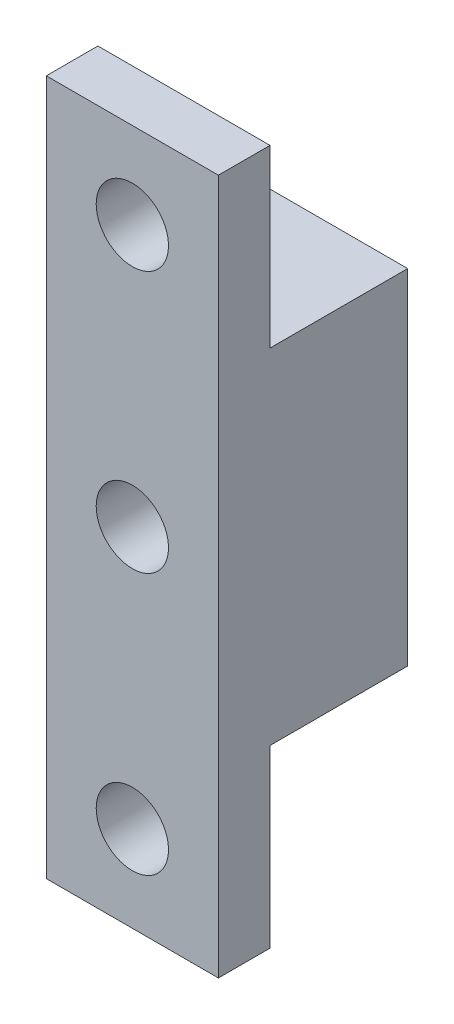
ISO-10303-21;
HEADER;
FILE_DESCRIPTION(('STEP AP214'),'2;1');
FILE_NAME('part.step','',(''),(''),'','','');
FILE_SCHEMA(('AUTOMOTIVE_DESIGN { 1 0 10303 214 1 1 1 1 }'));
ENDSEC;
DATA;
#1=APPLICATION_CONTEXT('core data for automotive mechanical design processes');
#2=APPLICATION_PROTOCOL_DEFINITION('international standard','automotive_design',2000,#1);
#3=PRODUCT_CONTEXT('',#1,'mechanical');
#4=PRODUCT('Part','Part','',(#3));
#5=PRODUCT_RELATED_PRODUCT_CATEGORY('part','',(#4));
#6=PRODUCT_DEFINITION_FORMATION('','',#4);
#7=PRODUCT_DEFINITION_CONTEXT('part definition',#1,'design');
#8=PRODUCT_DEFINITION('design','',#6,#7);
#9=PRODUCT_DEFINITION_SHAPE('','',#8);
#10=(LENGTH_UNIT() NAMED_UNIT(*) SI_UNIT(.MILLI.,.METRE.));
#11=(NAMED_UNIT(*) PLANE_ANGLE_UNIT() SI_UNIT($,.RADIAN.));
#12=(NAMED_UNIT(*) SI_UNIT($,.STERADIAN.) SOLID_ANGLE_UNIT());
#13=UNCERTAINTY_MEASURE_WITH_UNIT(LENGTH_MEASURE(1.E-05),#10,'distance_accuracy_value','');
#14=(GEOMETRIC_REPRESENTATION_CONTEXT(3) GLOBAL_UNCERTAINTY_ASSIGNED_CONTEXT((#13)) GLOBAL_UNIT_ASSIGNED_CONTEXT((#10,
#11,#12)) REPRESENTATION_CONTEXT('',''));
#15=CARTESIAN_POINT('',(0.,0.,0.));
#16=DIRECTION('',(0.,0.,1.));
#17=DIRECTION('',(1.,0.,0.));
#18=AXIS2_PLACEMENT_3D('',#15,#16,#17);
#19=CARTESIAN_POINT('',(0.,0.,-127.398862981559));
#20=DIRECTION('',(0.,0.,-1.));
#21=DIRECTION('',(-1.,0.,0.));
#22=AXIS2_PLACEMENT_3D('',#19,#20,#21);
#23=PLANE('',#22);
#24=CARTESIAN_POINT('',(5.,178.647805518623,-127.398862981559));
#25=DIRECTION('',(0.,0.,-1.));
#26=DIRECTION('',(-1.,0.,0.));
#27=AXIS2_PLACEMENT_3D('',#24,#25,#26);
#28=CIRCLE('',#27,2.09999999999998);
#29=CARTESIAN_POINT('',(2.90000000000002,178.647805518623,-127.398862981559));
#30=VERTEX_POINT('',#29);
#31=EDGE_CURVE('E157',#30,#30,#28,.T.);
#32=ORIENTED_EDGE('',*,*,#31,.F.);
#33=EDGE_LOOP('',(#32));
#34=FACE_BOUND('',#33,.T.);
#35=DIRECTION('',(0.,-1.,0.));
#36=VECTOR('',#35,1.);
#37=CARTESIAN_POINT('',(10.,0.,-127.398862981559));
#38=LINE('',#37,#36);
#39=CARTESIAN_POINT('',(10.,183.647805518623,-127.398862981559));
#40=VERTEX_POINT('',#39);
#41=CARTESIAN_POINT('',(10.,173.447805518623,-127.398862981559));
#42=VERTEX_POINT('',#41);
#43=EDGE_CURVE('E147',#40,#42,#38,.T.);
#44=ORIENTED_EDGE('',*,*,#43,.T.);
#45=DIRECTION('',(-1.,0.,0.));
#46=VECTOR('',#45,1.);
#47=CARTESIAN_POINT('',(0.,173.447805518623,-127.398862981559));
#48=LINE('',#47,#46);
#49=CARTESIAN_POINT('',(0.,173.447805518623,-127.398862981559));
#50=VERTEX_POINT('',#49);
#51=EDGE_CURVE('E58',#42,#50,#48,.T.);
#52=ORIENTED_EDGE('',*,*,#51,.T.);
#53=DIRECTION('',(0.,1.,0.));
#54=VECTOR('',#53,1.);
#55=CARTESIAN_POINT('',(0.,0.,-127.398862981559));
#56=LINE('',#55,#54);
#57=CARTESIAN_POINT('',(0.,183.647805518623,-127.398862981559));
#58=VERTEX_POINT('',#57);
#59=EDGE_CURVE('E152',#50,#58,#56,.T.);
#60=ORIENTED_EDGE('',*,*,#59,.T.);
#61=DIRECTION('',(1.,0.,0.));
#62=VECTOR('',#61,1.);
#63=CARTESIAN_POINT('',(0.,183.647805518623,-127.398862981559));
#64=LINE('',#63,#62);
#65=EDGE_CURVE('E155',#58,#40,#64,.T.);
#66=ORIENTED_EDGE('',*,*,#65,.T.);
#67=EDGE_LOOP('',(#44,#52,#60,#66));
#68=FACE_BOUND('',#67,.T.);
#69=ADVANCED_FACE('F43',(#34,#68),#23,.T.);
#70=CARTESIAN_POINT('',(10.,0.,-127.398862981559));
#71=DIRECTION('',(-1.,0.,0.));
#72=DIRECTION('',(0.,0.,1.));
#73=AXIS2_PLACEMENT_3D('',#70,#71,#72);
#74=PLANE('',#73);
#75=DIRECTION('',(0.,-1.,0.));
#76=VECTOR('',#75,1.);
#77=CARTESIAN_POINT('',(10.,0.,-124.398862981559));
#78=LINE('',#77,#76);
#79=CARTESIAN_POINT('',(10.,183.647805518623,-124.398862981559));
#80=VERTEX_POINT('',#79);
#81=CARTESIAN_POINT('',(10.,143.247805518623,-124.398862981559));
#82=VERTEX_POINT('',#81);
#83=EDGE_CURVE('E116',#80,#82,#78,.T.);
#84=ORIENTED_EDGE('',*,*,#83,.T.);
#85=DIRECTION('',(0.,0.,1.));
#86=VECTOR('',#85,1.);
#87=CARTESIAN_POINT('',(10.,143.247805518623,-127.398862981559));
#88=LINE('',#87,#86);
#89=CARTESIAN_POINT('',(10.,143.247805518623,-127.398862981559));
#90=VERTEX_POINT('',#89);
#91=EDGE_CURVE('E11',#90,#82,#88,.T.);
#92=ORIENTED_EDGE('',*,*,#91,.F.);
#93=CARTESIAN_POINT('',(10.,153.447805518623,-127.398862981559));
#94=VERTEX_POINT('',#93);
#95=EDGE_CURVE('E150',#94,#90,#38,.T.);
#96=ORIENTED_EDGE('',*,*,#95,.F.);
#97=DIRECTION('',(0.,0.,1.));
#98=VECTOR('',#97,1.);
#99=CARTESIAN_POINT('',(10.,153.447805518623,-135.398862981559));
#100=LINE('',#99,#98);
#101=CARTESIAN_POINT('',(10.,153.447805518623,-135.398862981559));
#102=VERTEX_POINT('',#101);
#103=EDGE_CURVE('E117',#102,#94,#100,.T.);
#104=ORIENTED_EDGE('',*,*,#103,.F.);
#105=DIRECTION('',(0.,-1.,0.));
#106=VECTOR('',#105,1.);
#107=CARTESIAN_POINT('',(10.,0.,-135.398862981559));
#108=LINE('',#107,#106);
#109=CARTESIAN_POINT('',(10.,173.447805518623,-135.398862981559));
#110=VERTEX_POINT('',#109);
#111=EDGE_CURVE('E120',#110,#102,#108,.T.);
#112=ORIENTED_EDGE('',*,*,#111,.F.);
#113=DIRECTION('',(0.,0.,1.));
#114=VECTOR('',#113,1.);
#115=CARTESIAN_POINT('',(10.,173.447805518623,-135.398862981559));
#116=LINE('',#115,#114);
#117=EDGE_CURVE('E108',#110,#42,#116,.T.);
#118=ORIENTED_EDGE('',*,*,#117,.T.);
#119=ORIENTED_EDGE('',*,*,#43,.F.);
#120=DIRECTION('',(0.,0.,1.));
#121=VECTOR('',#120,1.);
#122=CARTESIAN_POINT('',(10.,183.647805518623,-127.398862981559));
#123=LINE('',#122,#121);
#124=EDGE_CURVE('E163',#40,#80,#123,.T.);
#125=ORIENTED_EDGE('',*,*,#124,.T.);
#126=EDGE_LOOP('',(#84,#92,#96,#104,#112,#118,#119,#125));
#127=FACE_BOUND('',#126,.T.);
#128=ADVANCED_FACE('F45',(#127),#74,.F.);
#129=CARTESIAN_POINT('',(0.,143.247805518623,-127.398862981559));
#130=DIRECTION('',(0.,1.,0.));
#131=DIRECTION('',(0.,0.,1.));
#132=AXIS2_PLACEMENT_3D('',#129,#130,#131);
#133=PLANE('',#132);
#134=DIRECTION('',(-1.,0.,0.));
#135=VECTOR('',#134,1.);
#136=CARTESIAN_POINT('',(0.,143.247805518623,-124.398862981559));
#137=LINE('',#136,#135);
#138=CARTESIAN_POINT('',(0.,143.247805518623,-124.398862981559));
#139=VERTEX_POINT('',#138);
#140=EDGE_CURVE('E165',#82,#139,#137,.T.);
#141=ORIENTED_EDGE('',*,*,#140,.T.);
#142=DIRECTION('',(0.,0.,1.));
#143=VECTOR('',#142,1.);
#144=CARTESIAN_POINT('',(0.,143.247805518623,-127.398862981559));
#145=LINE('',#144,#143);
#146=CARTESIAN_POINT('',(0.,143.247805518623,-127.398862981559));
#147=VERTEX_POINT('',#146);
#148=EDGE_CURVE('E51',#147,#139,#145,.T.);
#149=ORIENTED_EDGE('',*,*,#148,.F.);
#150=DIRECTION('',(-1.,0.,0.));
#151=VECTOR('',#150,1.);
#152=CARTESIAN_POINT('',(0.,143.247805518623,-127.398862981559));
#153=LINE('',#152,#151);
#154=EDGE_CURVE('E149',#90,#147,#153,.T.);
#155=ORIENTED_EDGE('',*,*,#154,.F.);
#156=ORIENTED_EDGE('',*,*,#91,.T.);
#157=EDGE_LOOP('',(#141,#149,#155,#156));
#158=FACE_BOUND('',#157,.T.);
#159=ADVANCED_FACE('F221',(#158),#133,.F.);
#160=CARTESIAN_POINT('',(0.,0.,-127.398862981559));
#161=DIRECTION('',(1.,0.,0.));
#162=DIRECTION('',(0.,0.,-1.));
#163=AXIS2_PLACEMENT_3D('',#160,#161,#162);
#164=PLANE('',#163);
#165=DIRECTION('',(0.,1.,0.));
#166=VECTOR('',#165,1.);
#167=CARTESIAN_POINT('',(0.,0.,-124.398862981559));
#168=LINE('',#167,#166);
#169=CARTESIAN_POINT('',(0.,183.647805518623,-124.398862981559));
#170=VERTEX_POINT('',#169);
#171=EDGE_CURVE('E167',#139,#170,#168,.T.);
#172=ORIENTED_EDGE('',*,*,#171,.T.);
#173=DIRECTION('',(0.,0.,1.));
#174=VECTOR('',#173,1.);
#175=CARTESIAN_POINT('',(0.,183.647805518623,-127.398862981559));
#176=LINE('',#175,#174);
#177=EDGE_CURVE('E179',#58,#170,#176,.T.);
#178=ORIENTED_EDGE('',*,*,#177,.F.);
#179=ORIENTED_EDGE('',*,*,#59,.F.);
#180=DIRECTION('',(0.,0.,1.));
#181=VECTOR('',#180,1.);
#182=CARTESIAN_POINT('',(0.,173.447805518623,-135.398862981559));
#183=LINE('',#182,#181);
#184=CARTESIAN_POINT('',(0.,173.447805518623,-135.398862981559));
#185=VERTEX_POINT('',#184);
#186=EDGE_CURVE('E139',#185,#50,#183,.T.);
#187=ORIENTED_EDGE('',*,*,#186,.F.);
#188=DIRECTION('',(0.,1.,0.));
#189=VECTOR('',#188,1.);
#190=CARTESIAN_POINT('',(0.,0.,-135.398862981559));
#191=LINE('',#190,#189);
#192=CARTESIAN_POINT('',(0.,153.447805518623,-135.398862981559));
#193=VERTEX_POINT('',#192);
#194=EDGE_CURVE('E129',#193,#185,#191,.T.);
#195=ORIENTED_EDGE('',*,*,#194,.F.);
#196=DIRECTION('',(0.,0.,1.));
#197=VECTOR('',#196,1.);
#198=CARTESIAN_POINT('',(0.,153.447805518623,-135.398862981559));
#199=LINE('',#198,#197);
#200=CARTESIAN_POINT('',(0.,153.447805518623,-127.398862981559));
#201=VERTEX_POINT('',#200);
#202=EDGE_CURVE('E143',#193,#201,#199,.T.);
#203=ORIENTED_EDGE('',*,*,#202,.T.);
#204=EDGE_CURVE('E153',#147,#201,#56,.T.);
#205=ORIENTED_EDGE('',*,*,#204,.F.);
#206=ORIENTED_EDGE('',*,*,#148,.T.);
#207=EDGE_LOOP('',(#172,#178,#179,#187,#195,#203,#205,#206));
#208=FACE_BOUND('',#207,.T.);
#209=ADVANCED_FACE('F186',(#208),#164,.F.);
#210=CARTESIAN_POINT('',(5.,178.647805518623,-127.398862981559));
#211=DIRECTION('',(0.,0.,1.));
#212=DIRECTION('',(1.,0.,0.));
#213=AXIS2_PLACEMENT_3D('',#210,#211,#212);
#214=CYLINDRICAL_SURFACE('',#213,2.09999999999998);
#215=ORIENTED_EDGE('',*,*,#31,.T.);
#216=EDGE_LOOP('',(#215));
#217=FACE_BOUND('',#216,.T.);
#218=CARTESIAN_POINT('',(5.,178.647805518623,-124.398862981559));
#219=DIRECTION('',(0.,0.,-1.));
#220=DIRECTION('',(-1.,0.,0.));
#221=AXIS2_PLACEMENT_3D('',#218,#219,#220);
#222=CIRCLE('',#221,2.09999999999998);
#223=CARTESIAN_POINT('',(2.90000000000002,178.647805518623,-124.398862981559));
#224=VERTEX_POINT('',#223);
#225=EDGE_CURVE('E171',#224,#224,#222,.T.);
#226=ORIENTED_EDGE('',*,*,#225,.F.);
#227=EDGE_LOOP('',(#226));
#228=FACE_BOUND('',#227,.T.);
#229=ADVANCED_FACE('F241',(#217,#228),#214,.F.);
#230=CARTESIAN_POINT('',(0.,183.647805518623,-127.398862981559));
#231=DIRECTION('',(0.,-1.,0.));
#232=DIRECTION('',(0.,0.,-1.));
#233=AXIS2_PLACEMENT_3D('',#230,#231,#232);
#234=PLANE('',#233);
#235=DIRECTION('',(1.,0.,0.));
#236=VECTOR('',#235,1.);
#237=CARTESIAN_POINT('',(0.,183.647805518623,-124.398862981559));
#238=LINE('',#237,#236);
#239=EDGE_CURVE('E169',#170,#80,#238,.T.);
#240=ORIENTED_EDGE('',*,*,#239,.T.);
#241=ORIENTED_EDGE('',*,*,#124,.F.);
#242=ORIENTED_EDGE('',*,*,#65,.F.);
#243=ORIENTED_EDGE('',*,*,#177,.T.);
#244=EDGE_LOOP('',(#240,#241,#242,#243));
#245=FACE_BOUND('',#244,.T.);
#246=ADVANCED_FACE('F197',(#245),#234,.F.);
#247=CARTESIAN_POINT('',(5.,148.247805518623,-127.398862981559));
#248=DIRECTION('',(0.,0.,1.));
#249=DIRECTION('',(1.,0.,0.));
#250=AXIS2_PLACEMENT_3D('',#247,#248,#249);
#251=CYLINDRICAL_SURFACE('',#250,2.09999999999997);
#252=CARTESIAN_POINT('',(5.,148.247805518623,-127.398862981559));
#253=DIRECTION('',(0.,0.,-1.));
#254=DIRECTION('',(-1.,0.,0.));
#255=AXIS2_PLACEMENT_3D('',#252,#253,#254);
#256=CIRCLE('',#255,2.09999999999997);
#257=CARTESIAN_POINT('',(2.90000000000003,148.247805518623,-127.398862981559));
#258=VERTEX_POINT('',#257);
#259=EDGE_CURVE('E160',#258,#258,#256,.T.);
#260=ORIENTED_EDGE('',*,*,#259,.T.);
#261=EDGE_LOOP('',(#260));
#262=FACE_BOUND('',#261,.T.);
#263=CARTESIAN_POINT('',(5.,148.247805518623,-124.398862981559));
#264=DIRECTION('',(0.,0.,-1.));
#265=DIRECTION('',(-1.,0.,0.));
#266=AXIS2_PLACEMENT_3D('',#263,#264,#265);
#267=CIRCLE('',#266,2.09999999999997);
#268=CARTESIAN_POINT('',(2.90000000000003,148.247805518623,-124.398862981559));
#269=VERTEX_POINT('',#268);
#270=EDGE_CURVE('E174',#269,#269,#267,.T.);
#271=ORIENTED_EDGE('',*,*,#270,.F.);
#272=EDGE_LOOP('',(#271));
#273=FACE_BOUND('',#272,.T.);
#274=ADVANCED_FACE('F225',(#262,#273),#251,.F.);
#275=DIRECTION('',(-1.,0.,0.));
#276=VECTOR('',#275,1.);
#277=CARTESIAN_POINT('',(0.,153.447805518623,-127.398862981559));
#278=LINE('',#277,#276);
#279=EDGE_CURVE('E66',#94,#201,#278,.T.);
#280=ORIENTED_EDGE('',*,*,#279,.F.);
#281=ORIENTED_EDGE('',*,*,#95,.T.);
#282=ORIENTED_EDGE('',*,*,#154,.T.);
#283=ORIENTED_EDGE('',*,*,#204,.T.);
#284=EDGE_LOOP('',(#280,#281,#282,#283));
#285=FACE_BOUND('',#284,.T.);
#286=ORIENTED_EDGE('',*,*,#259,.F.);
#287=EDGE_LOOP('',(#286));
#288=FACE_BOUND('',#287,.T.);
#289=ADVANCED_FACE('F216',(#285,#288),#23,.T.);
#290=CARTESIAN_POINT('',(0.,0.,-124.398862981559));
#291=DIRECTION('',(0.,0.,-1.));
#292=DIRECTION('',(-1.,0.,0.));
#293=AXIS2_PLACEMENT_3D('',#290,#291,#292);
#294=PLANE('',#293);
#295=CARTESIAN_POINT('',(5.,163.447805518623,-124.398862981559));
#296=DIRECTION('',(0.,0.,-1.));
#297=DIRECTION('',(-1.,0.,0.));
#298=AXIS2_PLACEMENT_3D('',#295,#296,#297);
#299=CIRCLE('',#298,2.1);
#300=CARTESIAN_POINT('',(2.9,163.447805518623,-124.398862981559));
#301=VERTEX_POINT('',#300);
#302=EDGE_CURVE('E397',#301,#301,#299,.T.);
#303=ORIENTED_EDGE('',*,*,#302,.T.);
#304=EDGE_LOOP('',(#303));
#305=FACE_BOUND('',#304,.T.);
#306=ORIENTED_EDGE('',*,*,#83,.F.);
#307=ORIENTED_EDGE('',*,*,#239,.F.);
#308=ORIENTED_EDGE('',*,*,#171,.F.);
#309=ORIENTED_EDGE('',*,*,#140,.F.);
#310=EDGE_LOOP('',(#306,#307,#308,#309));
#311=FACE_BOUND('',#310,.T.);
#312=ORIENTED_EDGE('',*,*,#225,.T.);
#313=EDGE_LOOP('',(#312));
#314=FACE_BOUND('',#313,.T.);
#315=ORIENTED_EDGE('',*,*,#270,.T.);
#316=EDGE_LOOP('',(#315));
#317=FACE_BOUND('',#316,.T.);
#318=ADVANCED_FACE('F193',(#305,#311,#314,#317),#294,.F.);
#319=CARTESIAN_POINT('',(0.,173.447805518623,-135.398862981559));
#320=DIRECTION('',(0.,1.,0.));
#321=DIRECTION('',(0.,0.,1.));
#322=AXIS2_PLACEMENT_3D('',#319,#320,#321);
#323=PLANE('',#322);
#324=ORIENTED_EDGE('',*,*,#51,.F.);
#325=ORIENTED_EDGE('',*,*,#117,.F.);
#326=DIRECTION('',(-1.,0.,0.));
#327=VECTOR('',#326,1.);
#328=CARTESIAN_POINT('',(0.,173.447805518623,-135.398862981559));
#329=LINE('',#328,#327);
#330=EDGE_CURVE('E113',#110,#185,#329,.T.);
#331=ORIENTED_EDGE('',*,*,#330,.T.);
#332=ORIENTED_EDGE('',*,*,#186,.T.);
#333=EDGE_LOOP('',(#324,#325,#331,#332));
#334=FACE_BOUND('',#333,.T.);
#335=ADVANCED_FACE('F110',(#334),#323,.T.);
#336=CARTESIAN_POINT('',(0.,153.447805518623,-135.398862981559));
#337=DIRECTION('',(0.,1.,0.));
#338=DIRECTION('',(0.,0.,1.));
#339=AXIS2_PLACEMENT_3D('',#336,#337,#338);
#340=PLANE('',#339);
#341=ORIENTED_EDGE('',*,*,#279,.T.);
#342=ORIENTED_EDGE('',*,*,#202,.F.);
#343=DIRECTION('',(-1.,0.,0.));
#344=VECTOR('',#343,1.);
#345=CARTESIAN_POINT('',(0.,153.447805518623,-135.398862981559));
#346=LINE('',#345,#344);
#347=EDGE_CURVE('E125',#102,#193,#346,.T.);
#348=ORIENTED_EDGE('',*,*,#347,.F.);
#349=ORIENTED_EDGE('',*,*,#103,.T.);
#350=EDGE_LOOP('',(#341,#342,#348,#349));
#351=FACE_BOUND('',#350,.T.);
#352=ADVANCED_FACE('F202',(#351),#340,.F.);
#353=CARTESIAN_POINT('',(0.,0.,-135.398862981559));
#354=DIRECTION('',(0.,0.,-1.));
#355=DIRECTION('',(-1.,0.,0.));
#356=AXIS2_PLACEMENT_3D('',#353,#354,#355);
#357=PLANE('',#356);
#358=CARTESIAN_POINT('',(5.,163.447805518623,-135.398862981559));
#359=DIRECTION('',(0.,0.,-1.));
#360=DIRECTION('',(-1.,0.,0.));
#361=AXIS2_PLACEMENT_3D('',#358,#359,#360);
#362=CIRCLE('',#361,3.09999999999999);
#363=CARTESIAN_POINT('',(1.90000000000001,163.447805518623,-135.398862981559));
#364=VERTEX_POINT('',#363);
#365=EDGE_CURVE('E134',#364,#364,#362,.T.);
#366=ORIENTED_EDGE('',*,*,#365,.F.);
#367=EDGE_LOOP('',(#366));
#368=FACE_BOUND('',#367,.T.);
#369=ORIENTED_EDGE('',*,*,#330,.F.);
#370=ORIENTED_EDGE('',*,*,#111,.T.);
#371=ORIENTED_EDGE('',*,*,#347,.T.);
#372=ORIENTED_EDGE('',*,*,#194,.T.);
#373=EDGE_LOOP('',(#369,#370,#371,#372));
#374=FACE_BOUND('',#373,.T.);
#375=ADVANCED_FACE('F127',(#368,#374),#357,.T.);
#376=CARTESIAN_POINT('',(5.,163.447805518623,-131.398862981559));
#377=DIRECTION('',(0.,0.,-1.));
#378=DIRECTION('',(-1.,0.,0.));
#379=AXIS2_PLACEMENT_3D('',#376,#377,#378);
#380=CYLINDRICAL_SURFACE('',#379,3.09999999999999);
#381=CARTESIAN_POINT('',(5.,163.447805518623,-131.398862981559));
#382=DIRECTION('',(0.,0.,-1.));
#383=DIRECTION('',(-1.,0.,0.));
#384=AXIS2_PLACEMENT_3D('',#381,#382,#383);
#385=CIRCLE('',#384,3.09999999999999);
#386=CARTESIAN_POINT('',(1.90000000000001,163.447805518623,-131.398862981559));
#387=VERTEX_POINT('',#386);
#388=EDGE_CURVE('E140',#387,#387,#385,.T.);
#389=ORIENTED_EDGE('',*,*,#388,.F.);
#390=EDGE_LOOP('',(#389));
#391=FACE_BOUND('',#390,.T.);
#392=ORIENTED_EDGE('',*,*,#365,.T.);
#393=EDGE_LOOP('',(#392));
#394=FACE_BOUND('',#393,.T.);
#395=ADVANCED_FACE('F209',(#391,#394),#380,.F.);
#396=CARTESIAN_POINT('',(0.,0.,-131.398862981559));
#397=DIRECTION('',(0.,0.,-1.));
#398=DIRECTION('',(-1.,0.,0.));
#399=AXIS2_PLACEMENT_3D('',#396,#397,#398);
#400=PLANE('',#399);
#401=CARTESIAN_POINT('',(5.,163.447805518623,-131.398862981559));
#402=DIRECTION('',(0.,0.,-1.));
#403=DIRECTION('',(-1.,0.,0.));
#404=AXIS2_PLACEMENT_3D('',#401,#402,#403);
#405=CIRCLE('',#404,2.1);
#406=CARTESIAN_POINT('',(2.9,163.447805518623,-131.398862981559));
#407=VERTEX_POINT('',#406);
#408=EDGE_CURVE('E400',#407,#407,#405,.T.);
#409=ORIENTED_EDGE('',*,*,#408,.F.);
#410=EDGE_LOOP('',(#409));
#411=FACE_BOUND('',#410,.T.);
#412=ORIENTED_EDGE('',*,*,#388,.T.);
#413=EDGE_LOOP('',(#412));
#414=FACE_BOUND('',#413,.T.);
#415=ADVANCED_FACE('F369',(#411,#414),#400,.T.);
#416=CARTESIAN_POINT('',(5.,163.447805518623,-124.398862981559));
#417=DIRECTION('',(0.,0.,-1.));
#418=DIRECTION('',(-1.,0.,0.));
#419=AXIS2_PLACEMENT_3D('',#416,#417,#418);
#420=CYLINDRICAL_SURFACE('',#419,2.1);
#421=CARTESIAN_POINT('',(2.9,163.447805518623,-124.398862981559));
#422=CARTESIAN_POINT('',(2.9,163.447805518623,-124.471779648226));
#423=CARTESIAN_POINT('',(2.9,163.447805518623,-124.544696314892));
#424=CARTESIAN_POINT('',(2.9,163.447805518623,-124.690529648226));
#425=CARTESIAN_POINT('',(2.9,163.447805518623,-124.763446314892));
#426=CARTESIAN_POINT('',(2.9,163.447805518623,-124.909279648226));
#427=CARTESIAN_POINT('',(2.9,163.447805518623,-124.982196314892));
#428=CARTESIAN_POINT('',(2.9,163.447805518623,-125.128029648226));
#429=CARTESIAN_POINT('',(2.9,163.447805518623,-125.200946314892));
#430=CARTESIAN_POINT('',(2.9,163.447805518623,-125.346779648226));
#431=CARTESIAN_POINT('',(2.9,163.447805518623,-125.419696314892));
#432=CARTESIAN_POINT('',(2.9,163.447805518623,-125.565529648226));
#433=CARTESIAN_POINT('',(2.9,163.447805518623,-125.638446314892));
#434=CARTESIAN_POINT('',(2.9,163.447805518623,-125.784279648226));
#435=CARTESIAN_POINT('',(2.9,163.447805518623,-125.857196314892));
#436=CARTESIAN_POINT('',(2.9,163.447805518623,-126.003029648226));
#437=CARTESIAN_POINT('',(2.9,163.447805518623,-126.075946314892));
#438=CARTESIAN_POINT('',(2.9,163.447805518623,-126.221779648226));
#439=CARTESIAN_POINT('',(2.9,163.447805518623,-126.294696314892));
#440=CARTESIAN_POINT('',(2.9,163.447805518623,-126.440529648226));
#441=CARTESIAN_POINT('',(2.9,163.447805518623,-126.513446314892));
#442=CARTESIAN_POINT('',(2.9,163.447805518623,-126.659279648226));
#443=CARTESIAN_POINT('',(2.9,163.447805518623,-126.732196314892));
#444=CARTESIAN_POINT('',(2.9,163.447805518623,-126.878029648226));
#445=CARTESIAN_POINT('',(2.9,163.447805518623,-126.950946314892));
#446=CARTESIAN_POINT('',(2.9,163.447805518623,-127.096779648226));
#447=CARTESIAN_POINT('',(2.9,163.447805518623,-127.169696314892));
#448=CARTESIAN_POINT('',(2.9,163.447805518623,-127.315529648226));
#449=CARTESIAN_POINT('',(2.9,163.447805518623,-127.388446314892));
#450=CARTESIAN_POINT('',(2.9,163.447805518623,-127.534279648226));
#451=CARTESIAN_POINT('',(2.9,163.447805518623,-127.607196314892));
#452=CARTESIAN_POINT('',(2.9,163.447805518623,-127.753029648226));
#453=CARTESIAN_POINT('',(2.9,163.447805518623,-127.825946314892));
#454=CARTESIAN_POINT('',(2.9,163.447805518623,-127.971779648226));
#455=CARTESIAN_POINT('',(2.9,163.447805518623,-128.044696314892));
#456=CARTESIAN_POINT('',(2.9,163.447805518623,-128.190529648226));
#457=CARTESIAN_POINT('',(2.9,163.447805518623,-128.263446314892));
#458=CARTESIAN_POINT('',(2.9,163.447805518623,-128.409279648226));
#459=CARTESIAN_POINT('',(2.9,163.447805518623,-128.482196314892));
#460=CARTESIAN_POINT('',(2.9,163.447805518623,-128.628029648226));
#461=CARTESIAN_POINT('',(2.9,163.447805518623,-128.700946314892));
#462=CARTESIAN_POINT('',(2.9,163.447805518623,-128.846779648226));
#463=CARTESIAN_POINT('',(2.9,163.447805518623,-128.919696314892));
#464=CARTESIAN_POINT('',(2.9,163.447805518623,-129.065529648226));
#465=CARTESIAN_POINT('',(2.9,163.447805518623,-129.138446314892));
#466=CARTESIAN_POINT('',(2.9,163.447805518623,-129.284279648226));
#467=CARTESIAN_POINT('',(2.9,163.447805518623,-129.357196314892));
#468=CARTESIAN_POINT('',(2.9,163.447805518623,-129.503029648226));
#469=CARTESIAN_POINT('',(2.9,163.447805518623,-129.575946314892));
#470=CARTESIAN_POINT('',(2.9,163.447805518623,-129.721779648226));
#471=CARTESIAN_POINT('',(2.9,163.447805518623,-129.794696314892));
#472=CARTESIAN_POINT('',(2.9,163.447805518623,-129.940529648226));
#473=CARTESIAN_POINT('',(2.9,163.447805518623,-130.013446314892));
#474=CARTESIAN_POINT('',(2.9,163.447805518623,-130.159279648226));
#475=CARTESIAN_POINT('',(2.9,163.447805518623,-130.232196314892));
#476=CARTESIAN_POINT('',(2.9,163.447805518623,-130.378029648226));
#477=CARTESIAN_POINT('',(2.9,163.447805518623,-130.450946314892));
#478=CARTESIAN_POINT('',(2.9,163.447805518623,-130.596779648226));
#479=CARTESIAN_POINT('',(2.9,163.447805518623,-130.669696314892));
#480=CARTESIAN_POINT('',(2.9,163.447805518623,-130.815529648226));
#481=CARTESIAN_POINT('',(2.9,163.447805518623,-130.888446314892));
#482=CARTESIAN_POINT('',(2.9,163.447805518623,-131.034279648226));
#483=CARTESIAN_POINT('',(2.9,163.447805518623,-131.107196314892));
#484=CARTESIAN_POINT('',(2.9,163.447805518623,-131.253029648226));
#485=CARTESIAN_POINT('',(2.9,163.447805518623,-131.325946314892));
#486=CARTESIAN_POINT('',(2.9,163.447805518623,-131.398862981559));
#487=B_SPLINE_CURVE_WITH_KNOTS('',3,(#421,#422,#423,#424,#425,#426,#427,#428,#429,#430,#431,
#432,#433,#434,#435,#436,#437,#438,#439,#440,#441,#442,#443,#444,#445,#446,#447,#448,#449,#450,
#451,#452,#453,#454,#455,#456,#457,#458,#459,#460,#461,#462,#463,#464,#465,#466,#467,#468,#469,
#470,#471,#472,#473,#474,#475,#476,#477,#478,#479,#480,#481,#482,#483,#484,#485,#486),
.UNSPECIFIED.,.F.,.F.,(4,2,2,2,2,2,2,2,2,2,2,2,2,2,2,2,2,2,2,2,2,2,2,2,2,2,2,2,2,2,2,2,4),(0.,
0.218750000000004,0.437500000000007,0.656249999999997,0.875000000000015,1.09375,
1.31249999999999,1.53125000000001,1.75,1.96874999999999,2.18750000000001,2.40625,
2.62499999999999,2.84375000000001,3.0625,3.28125000000001,3.5,3.71874999999999,3.93750000000001,
4.15625,4.37499999999999,4.59375000000001,4.8125,5.03124999999999,5.25,5.46874999999999,
5.68749999999998,5.90625,6.12499999999999,6.34374999999998,6.5625,6.78124999999999,
6.99999999999998),.UNSPECIFIED.);
#488=EDGE_CURVE('BSEAM378',#301,#407,#487,.T.);
#489=ORIENTED_EDGE('',*,*,#302,.F.);
#490=ORIENTED_EDGE('',*,*,#408,.T.);
#491=ORIENTED_EDGE('',*,*,#488,.T.);
#492=ORIENTED_EDGE('',*,*,#488,.F.);
#493=EDGE_LOOP('',(#489,#491,#490,#492));
#494=FACE_BOUND('',#493,.T.);
#495=ADVANCED_FACE('F378',(#494),#420,.F.);
#496=CLOSED_SHELL('',(#69,#128,#159,#209,#229,#246,#274,#289,#318,#335,#352,#375,#395,#415,#495));
#497=MANIFOLD_SOLID_BREP('B2',#496);
#498=ADVANCED_BREP_SHAPE_REPRESENTATION('',(#18,#497),#14);
#499=SHAPE_DEFINITION_REPRESENTATION(#9,#498);
ENDSEC;
END-ISO-10303-21;
